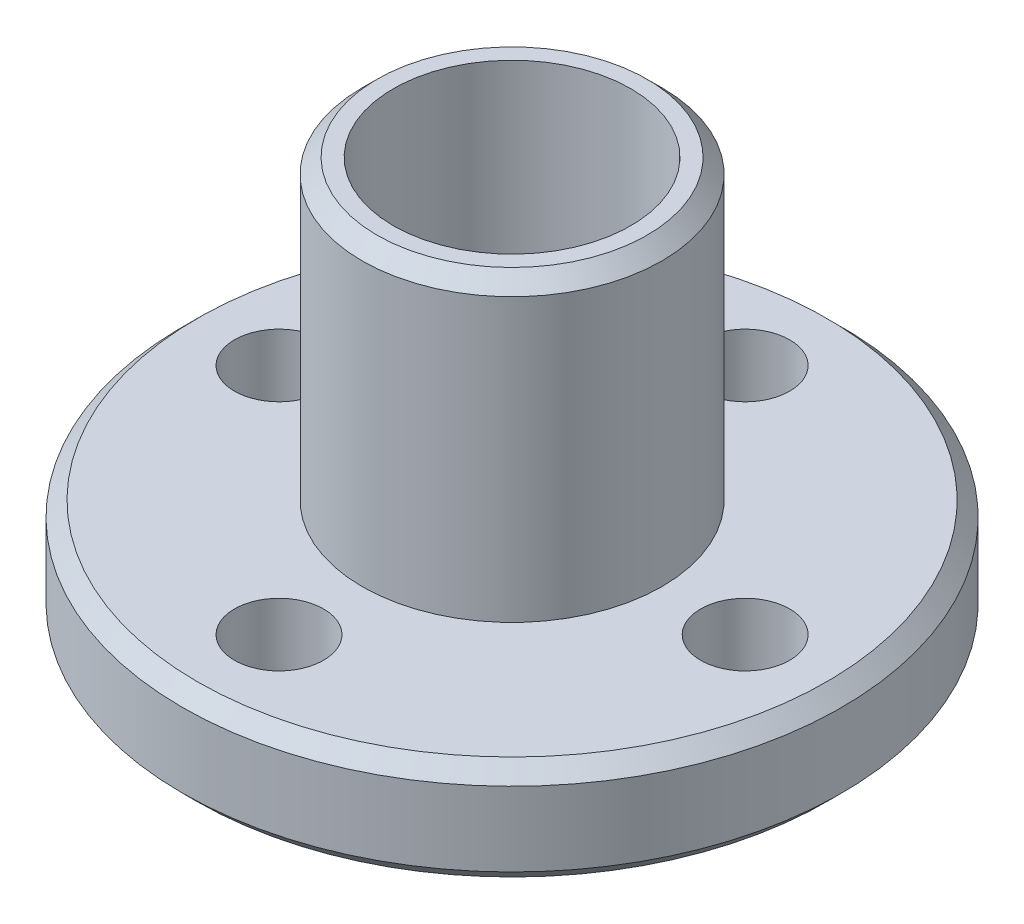
ISO-10303-21;
HEADER;
FILE_DESCRIPTION(('STEP AP214'),'2;1');
FILE_NAME('part.step','',(''),(''),'','','');
FILE_SCHEMA(('AUTOMOTIVE_DESIGN { 1 0 10303 214 1 1 1 1 }'));
ENDSEC;
DATA;
#1=APPLICATION_CONTEXT('core data for automotive mechanical design processes');
#2=APPLICATION_PROTOCOL_DEFINITION('international standard','automotive_design',2000,#1);
#3=PRODUCT_CONTEXT('',#1,'mechanical');
#4=PRODUCT('Part','Part','',(#3));
#5=PRODUCT_RELATED_PRODUCT_CATEGORY('part','',(#4));
#6=PRODUCT_DEFINITION_FORMATION('','',#4);
#7=PRODUCT_DEFINITION_CONTEXT('part definition',#1,'design');
#8=PRODUCT_DEFINITION('design','',#6,#7);
#9=PRODUCT_DEFINITION_SHAPE('','',#8);
#10=(LENGTH_UNIT() NAMED_UNIT(*) SI_UNIT(.MILLI.,.METRE.));
#11=(NAMED_UNIT(*) PLANE_ANGLE_UNIT() SI_UNIT($,.RADIAN.));
#12=(NAMED_UNIT(*) SI_UNIT($,.STERADIAN.) SOLID_ANGLE_UNIT());
#13=UNCERTAINTY_MEASURE_WITH_UNIT(LENGTH_MEASURE(1.E-05),#10,'distance_accuracy_value','');
#14=(GEOMETRIC_REPRESENTATION_CONTEXT(3) GLOBAL_UNCERTAINTY_ASSIGNED_CONTEXT((#13)) GLOBAL_UNIT_ASSIGNED_CONTEXT((#10,
#11,#12)) REPRESENTATION_CONTEXT('',''));
#15=CARTESIAN_POINT('',(0.,0.,0.));
#16=DIRECTION('',(0.,0.,1.));
#17=DIRECTION('',(1.,0.,0.));
#18=AXIS2_PLACEMENT_3D('',#15,#16,#17);
#19=CARTESIAN_POINT('',(0.,0.,0.));
#20=DIRECTION('',(0.,1.,0.));
#21=DIRECTION('',(0.,0.,1.));
#22=AXIS2_PLACEMENT_3D('',#19,#20,#21);
#23=PLANE('',#22);
#24=CARTESIAN_POINT('',(0.,0.,0.));
#25=DIRECTION('',(0.,1.,0.));
#26=DIRECTION('',(0.,0.,1.));
#27=AXIS2_PLACEMENT_3D('',#24,#25,#26);
#28=CIRCLE('',#27,5.55);
#29=CARTESIAN_POINT('',(0.,0.,5.55));
#30=VERTEX_POINT('',#29);
#31=EDGE_CURVE('E10',#30,#30,#28,.T.);
#32=ORIENTED_EDGE('',*,*,#31,.T.);
#33=EDGE_LOOP('',(#32));
#34=FACE_BOUND('',#33,.T.);
#35=CARTESIAN_POINT('',(0.,0.,0.));
#36=DIRECTION('',(0.,1.,0.));
#37=DIRECTION('',(0.,0.,1.));
#38=AXIS2_PLACEMENT_3D('',#35,#36,#37);
#39=CIRCLE('',#38,10.6);
#40=CARTESIAN_POINT('',(0.,0.,10.6));
#41=VERTEX_POINT('',#40);
#42=EDGE_CURVE('E52',#41,#41,#39,.F.);
#43=ORIENTED_EDGE('',*,*,#42,.T.);
#44=EDGE_LOOP('',(#43));
#45=FACE_BOUND('',#44,.T.);
#46=CARTESIAN_POINT('',(-7.85,0.,0.));
#47=DIRECTION('',(0.,-1.,0.));
#48=DIRECTION('',(0.,0.,-1.));
#49=AXIS2_PLACEMENT_3D('',#46,#47,#48);
#50=CIRCLE('',#49,1.5);
#51=CARTESIAN_POINT('',(-7.85,0.,-1.5));
#52=VERTEX_POINT('',#51);
#53=EDGE_CURVE('E79',#52,#52,#50,.T.);
#54=ORIENTED_EDGE('',*,*,#53,.F.);
#55=EDGE_LOOP('',(#54));
#56=FACE_BOUND('',#55,.T.);
#57=CARTESIAN_POINT('',(0.,0.,7.85));
#58=DIRECTION('',(0.,-1.,0.));
#59=DIRECTION('',(0.,0.,-1.));
#60=AXIS2_PLACEMENT_3D('',#57,#58,#59);
#61=CIRCLE('',#60,1.5);
#62=CARTESIAN_POINT('',(0.,0.,6.35));
#63=VERTEX_POINT('',#62);
#64=EDGE_CURVE('E95',#63,#63,#61,.T.);
#65=ORIENTED_EDGE('',*,*,#64,.F.);
#66=EDGE_LOOP('',(#65));
#67=FACE_BOUND('',#66,.T.);
#68=CARTESIAN_POINT('',(7.85,0.,0.));
#69=DIRECTION('',(0.,-1.,0.));
#70=DIRECTION('',(0.,0.,-1.));
#71=AXIS2_PLACEMENT_3D('',#68,#69,#70);
#72=CIRCLE('',#71,1.5);
#73=CARTESIAN_POINT('',(7.85,0.,-1.50000000000005));
#74=VERTEX_POINT('',#73);
#75=EDGE_CURVE('E89',#74,#74,#72,.T.);
#76=ORIENTED_EDGE('',*,*,#75,.F.);
#77=EDGE_LOOP('',(#76));
#78=FACE_BOUND('',#77,.T.);
#79=CARTESIAN_POINT('',(0.,0.,-7.85));
#80=DIRECTION('',(0.,-1.,0.));
#81=DIRECTION('',(0.,0.,-1.));
#82=AXIS2_PLACEMENT_3D('',#79,#80,#81);
#83=CIRCLE('',#82,1.5);
#84=CARTESIAN_POINT('',(0.,0.,-9.35));
#85=VERTEX_POINT('',#84);
#86=EDGE_CURVE('E83',#85,#85,#83,.T.);
#87=ORIENTED_EDGE('',*,*,#86,.F.);
#88=EDGE_LOOP('',(#87));
#89=FACE_BOUND('',#88,.T.);
#90=ADVANCED_FACE('F32',(#34,#45,#56,#67,#78,#89),#23,.F.);
#91=CARTESIAN_POINT('',(0.,3.5,0.));
#92=DIRECTION('',(0.,1.,0.));
#93=DIRECTION('',(0.,0.,1.));
#94=AXIS2_PLACEMENT_3D('',#91,#92,#93);
#95=PLANE('',#94);
#96=CARTESIAN_POINT('',(0.,3.5,0.));
#97=DIRECTION('',(0.,1.,0.));
#98=DIRECTION('',(0.,0.,1.));
#99=AXIS2_PLACEMENT_3D('',#96,#97,#98);
#100=CIRCLE('',#99,10.6);
#101=CARTESIAN_POINT('',(0.,3.5,10.6));
#102=VERTEX_POINT('',#101);
#103=EDGE_CURVE('E61',#102,#102,#100,.T.);
#104=ORIENTED_EDGE('',*,*,#103,.T.);
#105=EDGE_LOOP('',(#104));
#106=FACE_BOUND('',#105,.T.);
#107=CARTESIAN_POINT('',(-7.85,3.5,0.));
#108=DIRECTION('',(0.,1.,0.));
#109=DIRECTION('',(0.,0.,1.));
#110=AXIS2_PLACEMENT_3D('',#107,#108,#109);
#111=CIRCLE('',#110,1.5);
#112=CARTESIAN_POINT('',(-7.85,3.5,-1.5));
#113=VERTEX_POINT('',#112);
#114=EDGE_CURVE('E98',#113,#113,#111,.F.);
#115=ORIENTED_EDGE('',*,*,#114,.T.);
#116=EDGE_LOOP('',(#115));
#117=FACE_BOUND('',#116,.T.);
#118=CARTESIAN_POINT('',(0.,3.5,7.85));
#119=DIRECTION('',(0.,1.,0.));
#120=DIRECTION('',(0.,0.,1.));
#121=AXIS2_PLACEMENT_3D('',#118,#119,#120);
#122=CIRCLE('',#121,1.5);
#123=CARTESIAN_POINT('',(0.,3.5,6.35));
#124=VERTEX_POINT('',#123);
#125=EDGE_CURVE('E92',#124,#124,#122,.F.);
#126=ORIENTED_EDGE('',*,*,#125,.T.);
#127=EDGE_LOOP('',(#126));
#128=FACE_BOUND('',#127,.T.);
#129=CARTESIAN_POINT('',(7.85,3.5,0.));
#130=DIRECTION('',(0.,1.,0.));
#131=DIRECTION('',(0.,0.,1.));
#132=AXIS2_PLACEMENT_3D('',#129,#130,#131);
#133=CIRCLE('',#132,1.5);
#134=CARTESIAN_POINT('',(7.85,3.5,-1.50000000000005));
#135=VERTEX_POINT('',#134);
#136=EDGE_CURVE('E86',#135,#135,#133,.F.);
#137=ORIENTED_EDGE('',*,*,#136,.T.);
#138=EDGE_LOOP('',(#137));
#139=FACE_BOUND('',#138,.T.);
#140=CARTESIAN_POINT('',(0.,3.5,-7.85));
#141=DIRECTION('',(0.,1.,0.));
#142=DIRECTION('',(0.,0.,1.));
#143=AXIS2_PLACEMENT_3D('',#140,#141,#142);
#144=CIRCLE('',#143,1.5);
#145=CARTESIAN_POINT('',(0.,3.5,-9.35));
#146=VERTEX_POINT('',#145);
#147=EDGE_CURVE('E80',#146,#146,#144,.F.);
#148=ORIENTED_EDGE('',*,*,#147,.T.);
#149=EDGE_LOOP('',(#148));
#150=FACE_BOUND('',#149,.T.);
#151=CARTESIAN_POINT('',(0.,3.5,0.));
#152=DIRECTION('',(0.,1.,0.));
#153=DIRECTION('',(0.,0.,1.));
#154=AXIS2_PLACEMENT_3D('',#151,#152,#153);
#155=CIRCLE('',#154,5.05);
#156=CARTESIAN_POINT('',(0.,3.5,5.05));
#157=VERTEX_POINT('',#156);
#158=EDGE_CURVE('E70',#157,#157,#155,.T.);
#159=ORIENTED_EDGE('',*,*,#158,.F.);
#160=EDGE_LOOP('',(#159));
#161=FACE_BOUND('',#160,.T.);
#162=ADVANCED_FACE('F108',(#106,#117,#128,#139,#150,#161),#95,.T.);
#163=CARTESIAN_POINT('',(0.,3.5,0.));
#164=DIRECTION('',(0.,-1.,0.));
#165=DIRECTION('',(0.,0.,-1.));
#166=AXIS2_PLACEMENT_3D('',#163,#164,#165);
#167=CYLINDRICAL_SURFACE('',#166,11.1);
#168=CARTESIAN_POINT('',(0.,3.,0.));
#169=DIRECTION('',(0.,1.,0.));
#170=DIRECTION('',(0.,0.,1.));
#171=AXIS2_PLACEMENT_3D('',#168,#169,#170);
#172=CIRCLE('',#171,11.1);
#173=CARTESIAN_POINT('',(0.,3.,11.1));
#174=VERTEX_POINT('',#173);
#175=EDGE_CURVE('E55',#174,#174,#172,.F.);
#176=ORIENTED_EDGE('',*,*,#175,.T.);
#177=EDGE_LOOP('',(#176));
#178=FACE_BOUND('',#177,.T.);
#179=CARTESIAN_POINT('',(0.,0.500000000000004,0.));
#180=DIRECTION('',(0.,1.,0.));
#181=DIRECTION('',(0.,0.,1.));
#182=AXIS2_PLACEMENT_3D('',#179,#180,#181);
#183=CIRCLE('',#182,11.1);
#184=CARTESIAN_POINT('',(0.,0.500000000000004,11.1));
#185=VERTEX_POINT('',#184);
#186=EDGE_CURVE('E58',#185,#185,#183,.T.);
#187=ORIENTED_EDGE('',*,*,#186,.T.);
#188=EDGE_LOOP('',(#187));
#189=FACE_BOUND('',#188,.T.);
#190=ADVANCED_FACE('F148',(#178,#189),#167,.T.);
#191=CARTESIAN_POINT('',(0.,3.5,0.));
#192=DIRECTION('',(0.,-1.,0.));
#193=DIRECTION('',(0.,0.,-1.));
#194=AXIS2_PLACEMENT_3D('',#191,#192,#193);
#195=CYLINDRICAL_SURFACE('',#194,4.);
#196=CARTESIAN_POINT('',(0.,13.5,0.));
#197=DIRECTION('',(0.,1.,0.));
#198=DIRECTION('',(0.,0.,1.));
#199=AXIS2_PLACEMENT_3D('',#196,#197,#198);
#200=CIRCLE('',#199,4.);
#201=CARTESIAN_POINT('',(0.,13.5,4.));
#202=VERTEX_POINT('',#201);
#203=EDGE_CURVE('E73',#202,#202,#200,.T.);
#204=ORIENTED_EDGE('',*,*,#203,.T.);
#205=EDGE_LOOP('',(#204));
#206=FACE_BOUND('',#205,.T.);
#207=CARTESIAN_POINT('',(0.,-1.5,0.));
#208=DIRECTION('',(0.,-1.,0.));
#209=DIRECTION('',(0.,0.,-1.));
#210=AXIS2_PLACEMENT_3D('',#207,#208,#209);
#211=CIRCLE('',#210,4.);
#212=CARTESIAN_POINT('',(0.,-1.5,-4.));
#213=VERTEX_POINT('',#212);
#214=EDGE_CURVE('E76',#213,#213,#211,.T.);
#215=ORIENTED_EDGE('',*,*,#214,.T.);
#216=EDGE_LOOP('',(#215));
#217=FACE_BOUND('',#216,.T.);
#218=ADVANCED_FACE('F141',(#206,#217),#195,.F.);
#219=CARTESIAN_POINT('',(0.,13.5,0.));
#220=DIRECTION('',(0.,1.,0.));
#221=DIRECTION('',(0.,0.,1.));
#222=AXIS2_PLACEMENT_3D('',#219,#220,#221);
#223=PLANE('',#222);
#224=CARTESIAN_POINT('',(0.,13.5,0.));
#225=DIRECTION('',(0.,1.,0.));
#226=DIRECTION('',(0.,0.,1.));
#227=AXIS2_PLACEMENT_3D('',#224,#225,#226);
#228=CIRCLE('',#227,4.55);
#229=CARTESIAN_POINT('',(0.,13.5,4.55));
#230=VERTEX_POINT('',#229);
#231=EDGE_CURVE('E67',#230,#230,#228,.T.);
#232=ORIENTED_EDGE('',*,*,#231,.T.);
#233=EDGE_LOOP('',(#232));
#234=FACE_BOUND('',#233,.T.);
#235=ORIENTED_EDGE('',*,*,#203,.F.);
#236=EDGE_LOOP('',(#235));
#237=FACE_BOUND('',#236,.T.);
#238=ADVANCED_FACE('F138',(#234,#237),#223,.T.);
#239=CARTESIAN_POINT('',(0.,13.5,0.));
#240=DIRECTION('',(0.,-1.,0.));
#241=DIRECTION('',(0.,0.,-1.));
#242=AXIS2_PLACEMENT_3D('',#239,#240,#241);
#243=CYLINDRICAL_SURFACE('',#242,5.05);
#244=CARTESIAN_POINT('',(0.,13.,0.));
#245=DIRECTION('',(0.,1.,0.));
#246=DIRECTION('',(0.,0.,1.));
#247=AXIS2_PLACEMENT_3D('',#244,#245,#246);
#248=CIRCLE('',#247,5.05);
#249=CARTESIAN_POINT('',(0.,13.,5.05));
#250=VERTEX_POINT('',#249);
#251=EDGE_CURVE('E64',#250,#250,#248,.F.);
#252=ORIENTED_EDGE('',*,*,#251,.T.);
#253=EDGE_LOOP('',(#252));
#254=FACE_BOUND('',#253,.T.);
#255=ORIENTED_EDGE('',*,*,#158,.T.);
#256=EDGE_LOOP('',(#255));
#257=FACE_BOUND('',#256,.T.);
#258=ADVANCED_FACE('F135',(#254,#257),#243,.T.);
#259=CARTESIAN_POINT('',(0.,-1.5,0.));
#260=DIRECTION('',(0.,-1.,0.));
#261=DIRECTION('',(0.,0.,-1.));
#262=AXIS2_PLACEMENT_3D('',#259,#260,#261);
#263=PLANE('',#262);
#264=CARTESIAN_POINT('',(0.,-1.5,0.));
#265=DIRECTION('',(0.,-1.,0.));
#266=DIRECTION('',(0.,0.,-1.));
#267=AXIS2_PLACEMENT_3D('',#264,#265,#266);
#268=CIRCLE('',#267,4.55);
#269=CARTESIAN_POINT('',(0.,-1.5,-4.55));
#270=VERTEX_POINT('',#269);
#271=EDGE_CURVE('E47',#270,#270,#268,.T.);
#272=ORIENTED_EDGE('',*,*,#271,.T.);
#273=EDGE_LOOP('',(#272));
#274=FACE_BOUND('',#273,.T.);
#275=ORIENTED_EDGE('',*,*,#214,.F.);
#276=EDGE_LOOP('',(#275));
#277=FACE_BOUND('',#276,.T.);
#278=ADVANCED_FACE('F129',(#274,#277),#263,.T.);
#279=CARTESIAN_POINT('',(0.,-1.5,0.));
#280=DIRECTION('',(0.,1.,0.));
#281=DIRECTION('',(0.,0.,1.));
#282=AXIS2_PLACEMENT_3D('',#279,#280,#281);
#283=CYLINDRICAL_SURFACE('',#282,5.05);
#284=CARTESIAN_POINT('',(0.,-0.500000000000002,0.));
#285=DIRECTION('',(0.,1.,0.));
#286=DIRECTION('',(0.,0.,1.));
#287=AXIS2_PLACEMENT_3D('',#284,#285,#286);
#288=CIRCLE('',#287,5.05);
#289=CARTESIAN_POINT('',(0.,-0.500000000000002,5.05));
#290=VERTEX_POINT('',#289);
#291=EDGE_CURVE('E39',#290,#290,#288,.F.);
#292=ORIENTED_EDGE('',*,*,#291,.T.);
#293=EDGE_LOOP('',(#292));
#294=FACE_BOUND('',#293,.T.);
#295=CARTESIAN_POINT('',(0.,-0.999999999999999,0.));
#296=DIRECTION('',(0.,-1.,0.));
#297=DIRECTION('',(0.,0.,-1.));
#298=AXIS2_PLACEMENT_3D('',#295,#296,#297);
#299=CIRCLE('',#298,5.05);
#300=CARTESIAN_POINT('',(0.,-0.999999999999999,-5.05));
#301=VERTEX_POINT('',#300);
#302=EDGE_CURVE('E43',#301,#301,#299,.F.);
#303=ORIENTED_EDGE('',*,*,#302,.T.);
#304=EDGE_LOOP('',(#303));
#305=FACE_BOUND('',#304,.T.);
#306=ADVANCED_FACE('F119',(#294,#305),#283,.T.);
#307=CARTESIAN_POINT('',(0.,13.501,-7.85));
#308=DIRECTION('',(0.,-1.,0.));
#309=DIRECTION('',(0.,0.,-1.));
#310=AXIS2_PLACEMENT_3D('',#307,#308,#309);
#311=CYLINDRICAL_SURFACE('',#310,1.5);
#312=CARTESIAN_POINT('',(0.,3.5,-9.35));
#313=CARTESIAN_POINT('',(0.,3.46354166666666,-9.35));
#314=CARTESIAN_POINT('',(0.,3.42708333333333,-9.35));
#315=CARTESIAN_POINT('',(0.,3.35416666666666,-9.35));
#316=CARTESIAN_POINT('',(0.,3.31770833333333,-9.35));
#317=CARTESIAN_POINT('',(0.,3.24479166666666,-9.35));
#318=CARTESIAN_POINT('',(0.,3.20833333333333,-9.35));
#319=CARTESIAN_POINT('',(0.,3.13541666666666,-9.35));
#320=CARTESIAN_POINT('',(0.,3.09895833333333,-9.35));
#321=CARTESIAN_POINT('',(0.,3.02604166666666,-9.35));
#322=CARTESIAN_POINT('',(0.,2.98958333333333,-9.35));
#323=CARTESIAN_POINT('',(0.,2.91666666666667,-9.35));
#324=CARTESIAN_POINT('',(0.,2.88020833333333,-9.35));
#325=CARTESIAN_POINT('',(0.,2.80729166666667,-9.35));
#326=CARTESIAN_POINT('',(0.,2.77083333333333,-9.35));
#327=CARTESIAN_POINT('',(0.,2.69791666666667,-9.35));
#328=CARTESIAN_POINT('',(0.,2.66145833333333,-9.35));
#329=CARTESIAN_POINT('',(0.,2.58854166666667,-9.35));
#330=CARTESIAN_POINT('',(0.,2.55208333333333,-9.35));
#331=CARTESIAN_POINT('',(0.,2.47916666666667,-9.35));
#332=CARTESIAN_POINT('',(0.,2.44270833333333,-9.35));
#333=CARTESIAN_POINT('',(0.,2.36979166666667,-9.35));
#334=CARTESIAN_POINT('',(0.,2.33333333333333,-9.35));
#335=CARTESIAN_POINT('',(0.,2.26041666666667,-9.35));
#336=CARTESIAN_POINT('',(0.,2.22395833333333,-9.35));
#337=CARTESIAN_POINT('',(0.,2.15104166666667,-9.35));
#338=CARTESIAN_POINT('',(0.,2.11458333333333,-9.35));
#339=CARTESIAN_POINT('',(0.,2.04166666666667,-9.35));
#340=CARTESIAN_POINT('',(0.,2.00520833333333,-9.35));
#341=CARTESIAN_POINT('',(0.,1.93229166666667,-9.35));
#342=CARTESIAN_POINT('',(0.,1.89583333333333,-9.35));
#343=CARTESIAN_POINT('',(0.,1.82291666666667,-9.35));
#344=CARTESIAN_POINT('',(0.,1.78645833333333,-9.35));
#345=CARTESIAN_POINT('',(0.,1.71354166666667,-9.35));
#346=CARTESIAN_POINT('',(0.,1.67708333333333,-9.35));
#347=CARTESIAN_POINT('',(0.,1.60416666666667,-9.35));
#348=CARTESIAN_POINT('',(0.,1.56770833333333,-9.35));
#349=CARTESIAN_POINT('',(0.,1.49479166666667,-9.35));
#350=CARTESIAN_POINT('',(0.,1.45833333333333,-9.35));
#351=CARTESIAN_POINT('',(0.,1.38541666666667,-9.35));
#352=CARTESIAN_POINT('',(0.,1.34895833333333,-9.35));
#353=CARTESIAN_POINT('',(0.,1.27604166666667,-9.35));
#354=CARTESIAN_POINT('',(0.,1.23958333333333,-9.35));
#355=CARTESIAN_POINT('',(0.,1.16666666666667,-9.35));
#356=CARTESIAN_POINT('',(0.,1.13020833333333,-9.35));
#357=CARTESIAN_POINT('',(0.,1.05729166666667,-9.35));
#358=CARTESIAN_POINT('',(0.,1.02083333333333,-9.35));
#359=CARTESIAN_POINT('',(0.,0.947916666666668,-9.35));
#360=CARTESIAN_POINT('',(0.,0.911458333333334,-9.35));
#361=CARTESIAN_POINT('',(0.,0.838541666666667,-9.35));
#362=CARTESIAN_POINT('',(0.,0.802083333333334,-9.35));
#363=CARTESIAN_POINT('',(0.,0.729166666666667,-9.35));
#364=CARTESIAN_POINT('',(0.,0.692708333333334,-9.35));
#365=CARTESIAN_POINT('',(0.,0.619791666666667,-9.35));
#366=CARTESIAN_POINT('',(0.,0.583333333333334,-9.35));
#367=CARTESIAN_POINT('',(0.,0.510416666666668,-9.35));
#368=CARTESIAN_POINT('',(0.,0.473958333333335,-9.35));
#369=CARTESIAN_POINT('',(0.,0.401041666666668,-9.35));
#370=CARTESIAN_POINT('',(0.,0.364583333333334,-9.35));
#371=CARTESIAN_POINT('',(0.,0.291666666666668,-9.35));
#372=CARTESIAN_POINT('',(0.,0.255208333333335,-9.35));
#373=CARTESIAN_POINT('',(0.,0.182291666666669,-9.35));
#374=CARTESIAN_POINT('',(0.,0.145833333333335,-9.35));
#375=CARTESIAN_POINT('',(0.,0.0729166666666685,-9.35));
#376=CARTESIAN_POINT('',(0.,0.0364583333333351,-9.35));
#377=CARTESIAN_POINT('',(0.,0.,-9.35));
#378=B_SPLINE_CURVE_WITH_KNOTS('',3,(#312,#313,#314,#315,#316,#317,#318,#319,#320,#321,#322,
#323,#324,#325,#326,#327,#328,#329,#330,#331,#332,#333,#334,#335,#336,#337,#338,#339,#340,#341,
#342,#343,#344,#345,#346,#347,#348,#349,#350,#351,#352,#353,#354,#355,#356,#357,#358,#359,#360,
#361,#362,#363,#364,#365,#366,#367,#368,#369,#370,#371,#372,#373,#374,#375,#376,#377),
.UNSPECIFIED.,.F.,.F.,(4,2,2,2,2,2,2,2,2,2,2,2,2,2,2,2,2,2,2,2,2,2,2,2,2,2,2,2,2,2,2,2,4),(0.,
0.109375,0.21875,0.328125,0.4375,0.546874999999999,0.656249999999999,0.765624999999999,
0.874999999999999,0.984374999999999,1.09375,1.203125,1.3125,1.421875,1.53125,1.640625,1.75,
1.859375,1.96875,2.078125,2.1875,2.296875,2.40625,2.515625,2.625,2.734375,2.84375,2.953125,
3.0625,3.171875,3.28125,3.390625,3.5),.UNSPECIFIED.);
#379=EDGE_CURVE('BSEAM116',#146,#85,#378,.T.);
#380=ORIENTED_EDGE('',*,*,#147,.F.);
#381=ORIENTED_EDGE('',*,*,#86,.T.);
#382=ORIENTED_EDGE('',*,*,#379,.T.);
#383=ORIENTED_EDGE('',*,*,#379,.F.);
#384=EDGE_LOOP('',(#380,#382,#381,#383));
#385=FACE_BOUND('',#384,.T.);
#386=ADVANCED_FACE('F116',(#385),#311,.F.);
#387=CARTESIAN_POINT('',(7.85,13.501,0.));
#388=DIRECTION('',(0.,-1.,0.));
#389=DIRECTION('',(0.,0.,-1.));
#390=AXIS2_PLACEMENT_3D('',#387,#388,#389);
#391=CYLINDRICAL_SURFACE('',#390,1.5);
#392=CARTESIAN_POINT('',(7.85,3.5,-1.50000000000005));
#393=CARTESIAN_POINT('',(7.85,3.46354166666666,-1.50000000000005));
#394=CARTESIAN_POINT('',(7.85,3.42708333333333,-1.50000000000005));
#395=CARTESIAN_POINT('',(7.85,3.35416666666666,-1.50000000000005));
#396=CARTESIAN_POINT('',(7.85,3.31770833333333,-1.50000000000005));
#397=CARTESIAN_POINT('',(7.85,3.24479166666666,-1.50000000000005));
#398=CARTESIAN_POINT('',(7.85,3.20833333333333,-1.50000000000005));
#399=CARTESIAN_POINT('',(7.85,3.13541666666666,-1.50000000000005));
#400=CARTESIAN_POINT('',(7.85,3.09895833333333,-1.50000000000005));
#401=CARTESIAN_POINT('',(7.85,3.02604166666666,-1.50000000000005));
#402=CARTESIAN_POINT('',(7.85,2.98958333333333,-1.50000000000005));
#403=CARTESIAN_POINT('',(7.85,2.91666666666667,-1.50000000000005));
#404=CARTESIAN_POINT('',(7.85,2.88020833333333,-1.50000000000005));
#405=CARTESIAN_POINT('',(7.85,2.80729166666667,-1.50000000000005));
#406=CARTESIAN_POINT('',(7.85,2.77083333333333,-1.50000000000005));
#407=CARTESIAN_POINT('',(7.85,2.69791666666667,-1.50000000000005));
#408=CARTESIAN_POINT('',(7.85,2.66145833333333,-1.50000000000005));
#409=CARTESIAN_POINT('',(7.85,2.58854166666667,-1.50000000000005));
#410=CARTESIAN_POINT('',(7.85,2.55208333333333,-1.50000000000005));
#411=CARTESIAN_POINT('',(7.85,2.47916666666667,-1.50000000000005));
#412=CARTESIAN_POINT('',(7.85,2.44270833333333,-1.50000000000005));
#413=CARTESIAN_POINT('',(7.85,2.36979166666667,-1.50000000000005));
#414=CARTESIAN_POINT('',(7.85,2.33333333333333,-1.50000000000005));
#415=CARTESIAN_POINT('',(7.85,2.26041666666667,-1.50000000000005));
#416=CARTESIAN_POINT('',(7.85,2.22395833333333,-1.50000000000005));
#417=CARTESIAN_POINT('',(7.85,2.15104166666667,-1.50000000000005));
#418=CARTESIAN_POINT('',(7.85,2.11458333333333,-1.50000000000005));
#419=CARTESIAN_POINT('',(7.85,2.04166666666667,-1.50000000000005));
#420=CARTESIAN_POINT('',(7.85,2.00520833333333,-1.50000000000005));
#421=CARTESIAN_POINT('',(7.85,1.93229166666667,-1.50000000000005));
#422=CARTESIAN_POINT('',(7.85,1.89583333333333,-1.50000000000005));
#423=CARTESIAN_POINT('',(7.85,1.82291666666667,-1.50000000000005));
#424=CARTESIAN_POINT('',(7.85,1.78645833333333,-1.50000000000005));
#425=CARTESIAN_POINT('',(7.85,1.71354166666667,-1.50000000000005));
#426=CARTESIAN_POINT('',(7.85,1.67708333333333,-1.50000000000005));
#427=CARTESIAN_POINT('',(7.85,1.60416666666667,-1.50000000000005));
#428=CARTESIAN_POINT('',(7.85,1.56770833333333,-1.50000000000005));
#429=CARTESIAN_POINT('',(7.85,1.49479166666667,-1.50000000000005));
#430=CARTESIAN_POINT('',(7.85,1.45833333333333,-1.50000000000005));
#431=CARTESIAN_POINT('',(7.85,1.38541666666667,-1.50000000000005));
#432=CARTESIAN_POINT('',(7.85,1.34895833333333,-1.50000000000005));
#433=CARTESIAN_POINT('',(7.85,1.27604166666667,-1.50000000000005));
#434=CARTESIAN_POINT('',(7.85,1.23958333333333,-1.50000000000005));
#435=CARTESIAN_POINT('',(7.85,1.16666666666667,-1.50000000000005));
#436=CARTESIAN_POINT('',(7.85,1.13020833333333,-1.50000000000005));
#437=CARTESIAN_POINT('',(7.85,1.05729166666667,-1.50000000000005));
#438=CARTESIAN_POINT('',(7.85,1.02083333333333,-1.50000000000005));
#439=CARTESIAN_POINT('',(7.85,0.947916666666668,-1.50000000000005));
#440=CARTESIAN_POINT('',(7.85,0.911458333333334,-1.50000000000005));
#441=CARTESIAN_POINT('',(7.85,0.838541666666667,-1.50000000000005));
#442=CARTESIAN_POINT('',(7.85,0.802083333333334,-1.50000000000005));
#443=CARTESIAN_POINT('',(7.85,0.729166666666667,-1.50000000000005));
#444=CARTESIAN_POINT('',(7.85,0.692708333333334,-1.50000000000005));
#445=CARTESIAN_POINT('',(7.85,0.619791666666667,-1.50000000000005));
#446=CARTESIAN_POINT('',(7.85,0.583333333333334,-1.50000000000005));
#447=CARTESIAN_POINT('',(7.85,0.510416666666668,-1.50000000000005));
#448=CARTESIAN_POINT('',(7.85,0.473958333333335,-1.50000000000005));
#449=CARTESIAN_POINT('',(7.85,0.401041666666668,-1.50000000000005));
#450=CARTESIAN_POINT('',(7.85,0.364583333333334,-1.50000000000005));
#451=CARTESIAN_POINT('',(7.85,0.291666666666668,-1.50000000000005));
#452=CARTESIAN_POINT('',(7.85,0.255208333333335,-1.50000000000005));
#453=CARTESIAN_POINT('',(7.85,0.182291666666669,-1.50000000000005));
#454=CARTESIAN_POINT('',(7.85,0.145833333333335,-1.50000000000005));
#455=CARTESIAN_POINT('',(7.85,0.0729166666666685,-1.50000000000005));
#456=CARTESIAN_POINT('',(7.85,0.0364583333333351,-1.50000000000005));
#457=CARTESIAN_POINT('',(7.85,0.,-1.50000000000005));
#458=B_SPLINE_CURVE_WITH_KNOTS('',3,(#392,#393,#394,#395,#396,#397,#398,#399,#400,#401,#402,
#403,#404,#405,#406,#407,#408,#409,#410,#411,#412,#413,#414,#415,#416,#417,#418,#419,#420,#421,
#422,#423,#424,#425,#426,#427,#428,#429,#430,#431,#432,#433,#434,#435,#436,#437,#438,#439,#440,
#441,#442,#443,#444,#445,#446,#447,#448,#449,#450,#451,#452,#453,#454,#455,#456,#457),
.UNSPECIFIED.,.F.,.F.,(4,2,2,2,2,2,2,2,2,2,2,2,2,2,2,2,2,2,2,2,2,2,2,2,2,2,2,2,2,2,2,2,4),(0.,
0.109375,0.21875,0.328125,0.4375,0.546874999999999,0.656249999999999,0.765624999999999,
0.874999999999999,0.984374999999999,1.09375,1.203125,1.3125,1.421875,1.53125,1.640625,1.75,
1.859375,1.96875,2.078125,2.1875,2.296875,2.40625,2.515625,2.625,2.734375,2.84375,2.953125,
3.0625,3.171875,3.28125,3.390625,3.5),.UNSPECIFIED.);
#459=EDGE_CURVE('BSEAM118',#135,#74,#458,.T.);
#460=ORIENTED_EDGE('',*,*,#136,.F.);
#461=ORIENTED_EDGE('',*,*,#75,.T.);
#462=ORIENTED_EDGE('',*,*,#459,.T.);
#463=ORIENTED_EDGE('',*,*,#459,.F.);
#464=EDGE_LOOP('',(#460,#462,#461,#463));
#465=FACE_BOUND('',#464,.T.);
#466=ADVANCED_FACE('F118',(#465),#391,.F.);
#467=CARTESIAN_POINT('',(0.,13.501,7.85));
#468=DIRECTION('',(0.,-1.,0.));
#469=DIRECTION('',(0.,0.,-1.));
#470=AXIS2_PLACEMENT_3D('',#467,#468,#469);
#471=CYLINDRICAL_SURFACE('',#470,1.5);
#472=CARTESIAN_POINT('',(0.,3.5,6.35));
#473=CARTESIAN_POINT('',(0.,3.46354166666666,6.35));
#474=CARTESIAN_POINT('',(0.,3.42708333333333,6.35));
#475=CARTESIAN_POINT('',(0.,3.35416666666666,6.35));
#476=CARTESIAN_POINT('',(0.,3.31770833333333,6.35));
#477=CARTESIAN_POINT('',(0.,3.24479166666666,6.35));
#478=CARTESIAN_POINT('',(0.,3.20833333333333,6.35));
#479=CARTESIAN_POINT('',(0.,3.13541666666666,6.35));
#480=CARTESIAN_POINT('',(0.,3.09895833333333,6.35));
#481=CARTESIAN_POINT('',(0.,3.02604166666666,6.35));
#482=CARTESIAN_POINT('',(0.,2.98958333333333,6.35));
#483=CARTESIAN_POINT('',(0.,2.91666666666667,6.35));
#484=CARTESIAN_POINT('',(0.,2.88020833333333,6.35));
#485=CARTESIAN_POINT('',(0.,2.80729166666667,6.35));
#486=CARTESIAN_POINT('',(0.,2.77083333333333,6.35));
#487=CARTESIAN_POINT('',(0.,2.69791666666667,6.35));
#488=CARTESIAN_POINT('',(0.,2.66145833333333,6.35));
#489=CARTESIAN_POINT('',(0.,2.58854166666667,6.35));
#490=CARTESIAN_POINT('',(0.,2.55208333333333,6.35));
#491=CARTESIAN_POINT('',(0.,2.47916666666667,6.35));
#492=CARTESIAN_POINT('',(0.,2.44270833333333,6.35));
#493=CARTESIAN_POINT('',(0.,2.36979166666667,6.35));
#494=CARTESIAN_POINT('',(0.,2.33333333333333,6.35));
#495=CARTESIAN_POINT('',(0.,2.26041666666667,6.35));
#496=CARTESIAN_POINT('',(0.,2.22395833333333,6.35));
#497=CARTESIAN_POINT('',(0.,2.15104166666667,6.35));
#498=CARTESIAN_POINT('',(0.,2.11458333333333,6.35));
#499=CARTESIAN_POINT('',(0.,2.04166666666667,6.35));
#500=CARTESIAN_POINT('',(0.,2.00520833333333,6.35));
#501=CARTESIAN_POINT('',(0.,1.93229166666667,6.35));
#502=CARTESIAN_POINT('',(0.,1.89583333333333,6.35));
#503=CARTESIAN_POINT('',(0.,1.82291666666667,6.35));
#504=CARTESIAN_POINT('',(0.,1.78645833333333,6.35));
#505=CARTESIAN_POINT('',(0.,1.71354166666667,6.35));
#506=CARTESIAN_POINT('',(0.,1.67708333333333,6.35));
#507=CARTESIAN_POINT('',(0.,1.60416666666667,6.35));
#508=CARTESIAN_POINT('',(0.,1.56770833333333,6.35));
#509=CARTESIAN_POINT('',(0.,1.49479166666667,6.35));
#510=CARTESIAN_POINT('',(0.,1.45833333333333,6.35));
#511=CARTESIAN_POINT('',(0.,1.38541666666667,6.35));
#512=CARTESIAN_POINT('',(0.,1.34895833333333,6.35));
#513=CARTESIAN_POINT('',(0.,1.27604166666667,6.35));
#514=CARTESIAN_POINT('',(0.,1.23958333333333,6.35));
#515=CARTESIAN_POINT('',(0.,1.16666666666667,6.35));
#516=CARTESIAN_POINT('',(0.,1.13020833333333,6.35));
#517=CARTESIAN_POINT('',(0.,1.05729166666667,6.35));
#518=CARTESIAN_POINT('',(0.,1.02083333333333,6.35));
#519=CARTESIAN_POINT('',(0.,0.947916666666668,6.35));
#520=CARTESIAN_POINT('',(0.,0.911458333333334,6.35));
#521=CARTESIAN_POINT('',(0.,0.838541666666667,6.35));
#522=CARTESIAN_POINT('',(0.,0.802083333333334,6.35));
#523=CARTESIAN_POINT('',(0.,0.729166666666667,6.35));
#524=CARTESIAN_POINT('',(0.,0.692708333333334,6.35));
#525=CARTESIAN_POINT('',(0.,0.619791666666667,6.35));
#526=CARTESIAN_POINT('',(0.,0.583333333333334,6.35));
#527=CARTESIAN_POINT('',(0.,0.510416666666668,6.35));
#528=CARTESIAN_POINT('',(0.,0.473958333333335,6.35));
#529=CARTESIAN_POINT('',(0.,0.401041666666668,6.35));
#530=CARTESIAN_POINT('',(0.,0.364583333333334,6.35));
#531=CARTESIAN_POINT('',(0.,0.291666666666668,6.35));
#532=CARTESIAN_POINT('',(0.,0.255208333333335,6.35));
#533=CARTESIAN_POINT('',(0.,0.182291666666669,6.35));
#534=CARTESIAN_POINT('',(0.,0.145833333333335,6.35));
#535=CARTESIAN_POINT('',(0.,0.0729166666666685,6.35));
#536=CARTESIAN_POINT('',(0.,0.0364583333333351,6.35));
#537=CARTESIAN_POINT('',(0.,0.,6.35));
#538=B_SPLINE_CURVE_WITH_KNOTS('',3,(#472,#473,#474,#475,#476,#477,#478,#479,#480,#481,#482,
#483,#484,#485,#486,#487,#488,#489,#490,#491,#492,#493,#494,#495,#496,#497,#498,#499,#500,#501,
#502,#503,#504,#505,#506,#507,#508,#509,#510,#511,#512,#513,#514,#515,#516,#517,#518,#519,#520,
#521,#522,#523,#524,#525,#526,#527,#528,#529,#530,#531,#532,#533,#534,#535,#536,#537),
.UNSPECIFIED.,.F.,.F.,(4,2,2,2,2,2,2,2,2,2,2,2,2,2,2,2,2,2,2,2,2,2,2,2,2,2,2,2,2,2,2,2,4),(0.,
0.109375,0.21875,0.328125,0.4375,0.546874999999999,0.656249999999999,0.765624999999999,
0.874999999999999,0.984374999999999,1.09375,1.203125,1.3125,1.421875,1.53125,1.640625,1.75,
1.859375,1.96875,2.078125,2.1875,2.296875,2.40625,2.515625,2.625,2.734375,2.84375,2.953125,
3.0625,3.171875,3.28125,3.390625,3.5),.UNSPECIFIED.);
#539=EDGE_CURVE('BSEAM126',#124,#63,#538,.T.);
#540=ORIENTED_EDGE('',*,*,#125,.F.);
#541=ORIENTED_EDGE('',*,*,#64,.T.);
#542=ORIENTED_EDGE('',*,*,#539,.T.);
#543=ORIENTED_EDGE('',*,*,#539,.F.);
#544=EDGE_LOOP('',(#540,#542,#541,#543));
#545=FACE_BOUND('',#544,.T.);
#546=ADVANCED_FACE('F126',(#545),#471,.F.);
#547=CARTESIAN_POINT('',(-7.85,13.501,0.));
#548=DIRECTION('',(0.,-1.,0.));
#549=DIRECTION('',(0.,0.,-1.));
#550=AXIS2_PLACEMENT_3D('',#547,#548,#549);
#551=CYLINDRICAL_SURFACE('',#550,1.5);
#552=CARTESIAN_POINT('',(-7.85,3.5,-1.5));
#553=CARTESIAN_POINT('',(-7.85,3.46354166666666,-1.5));
#554=CARTESIAN_POINT('',(-7.85,3.42708333333333,-1.5));
#555=CARTESIAN_POINT('',(-7.85,3.35416666666666,-1.5));
#556=CARTESIAN_POINT('',(-7.85,3.31770833333333,-1.5));
#557=CARTESIAN_POINT('',(-7.85,3.24479166666666,-1.5));
#558=CARTESIAN_POINT('',(-7.85,3.20833333333333,-1.5));
#559=CARTESIAN_POINT('',(-7.85,3.13541666666666,-1.5));
#560=CARTESIAN_POINT('',(-7.85,3.09895833333333,-1.5));
#561=CARTESIAN_POINT('',(-7.85,3.02604166666666,-1.5));
#562=CARTESIAN_POINT('',(-7.85,2.98958333333333,-1.5));
#563=CARTESIAN_POINT('',(-7.85,2.91666666666667,-1.5));
#564=CARTESIAN_POINT('',(-7.85,2.88020833333333,-1.5));
#565=CARTESIAN_POINT('',(-7.85,2.80729166666667,-1.5));
#566=CARTESIAN_POINT('',(-7.85,2.77083333333333,-1.5));
#567=CARTESIAN_POINT('',(-7.85,2.69791666666667,-1.5));
#568=CARTESIAN_POINT('',(-7.85,2.66145833333333,-1.5));
#569=CARTESIAN_POINT('',(-7.85,2.58854166666667,-1.5));
#570=CARTESIAN_POINT('',(-7.85,2.55208333333333,-1.5));
#571=CARTESIAN_POINT('',(-7.85,2.47916666666667,-1.5));
#572=CARTESIAN_POINT('',(-7.85,2.44270833333333,-1.5));
#573=CARTESIAN_POINT('',(-7.85,2.36979166666667,-1.5));
#574=CARTESIAN_POINT('',(-7.85,2.33333333333333,-1.5));
#575=CARTESIAN_POINT('',(-7.85,2.26041666666667,-1.5));
#576=CARTESIAN_POINT('',(-7.85,2.22395833333333,-1.5));
#577=CARTESIAN_POINT('',(-7.85,2.15104166666667,-1.5));
#578=CARTESIAN_POINT('',(-7.85,2.11458333333333,-1.5));
#579=CARTESIAN_POINT('',(-7.85,2.04166666666667,-1.5));
#580=CARTESIAN_POINT('',(-7.85,2.00520833333333,-1.5));
#581=CARTESIAN_POINT('',(-7.85,1.93229166666667,-1.5));
#582=CARTESIAN_POINT('',(-7.85,1.89583333333333,-1.5));
#583=CARTESIAN_POINT('',(-7.85,1.82291666666667,-1.5));
#584=CARTESIAN_POINT('',(-7.85,1.78645833333333,-1.5));
#585=CARTESIAN_POINT('',(-7.85,1.71354166666667,-1.5));
#586=CARTESIAN_POINT('',(-7.85,1.67708333333333,-1.5));
#587=CARTESIAN_POINT('',(-7.85,1.60416666666667,-1.5));
#588=CARTESIAN_POINT('',(-7.85,1.56770833333333,-1.5));
#589=CARTESIAN_POINT('',(-7.85,1.49479166666667,-1.5));
#590=CARTESIAN_POINT('',(-7.85,1.45833333333333,-1.5));
#591=CARTESIAN_POINT('',(-7.85,1.38541666666667,-1.5));
#592=CARTESIAN_POINT('',(-7.85,1.34895833333333,-1.5));
#593=CARTESIAN_POINT('',(-7.85,1.27604166666667,-1.5));
#594=CARTESIAN_POINT('',(-7.85,1.23958333333333,-1.5));
#595=CARTESIAN_POINT('',(-7.85,1.16666666666667,-1.5));
#596=CARTESIAN_POINT('',(-7.85,1.13020833333333,-1.5));
#597=CARTESIAN_POINT('',(-7.85,1.05729166666667,-1.5));
#598=CARTESIAN_POINT('',(-7.85,1.02083333333333,-1.5));
#599=CARTESIAN_POINT('',(-7.85,0.947916666666668,-1.5));
#600=CARTESIAN_POINT('',(-7.85,0.911458333333334,-1.5));
#601=CARTESIAN_POINT('',(-7.85,0.838541666666667,-1.5));
#602=CARTESIAN_POINT('',(-7.85,0.802083333333334,-1.5));
#603=CARTESIAN_POINT('',(-7.85,0.729166666666667,-1.5));
#604=CARTESIAN_POINT('',(-7.85,0.692708333333334,-1.5));
#605=CARTESIAN_POINT('',(-7.85,0.619791666666667,-1.5));
#606=CARTESIAN_POINT('',(-7.85,0.583333333333334,-1.5));
#607=CARTESIAN_POINT('',(-7.85,0.510416666666668,-1.5));
#608=CARTESIAN_POINT('',(-7.85,0.473958333333335,-1.5));
#609=CARTESIAN_POINT('',(-7.85,0.401041666666668,-1.5));
#610=CARTESIAN_POINT('',(-7.85,0.364583333333334,-1.5));
#611=CARTESIAN_POINT('',(-7.85,0.291666666666668,-1.5));
#612=CARTESIAN_POINT('',(-7.85,0.255208333333335,-1.5));
#613=CARTESIAN_POINT('',(-7.85,0.182291666666669,-1.5));
#614=CARTESIAN_POINT('',(-7.85,0.145833333333335,-1.5));
#615=CARTESIAN_POINT('',(-7.85,0.0729166666666685,-1.5));
#616=CARTESIAN_POINT('',(-7.85,0.0364583333333351,-1.5));
#617=CARTESIAN_POINT('',(-7.85,0.,-1.5));
#618=B_SPLINE_CURVE_WITH_KNOTS('',3,(#552,#553,#554,#555,#556,#557,#558,#559,#560,#561,#562,
#563,#564,#565,#566,#567,#568,#569,#570,#571,#572,#573,#574,#575,#576,#577,#578,#579,#580,#581,
#582,#583,#584,#585,#586,#587,#588,#589,#590,#591,#592,#593,#594,#595,#596,#597,#598,#599,#600,
#601,#602,#603,#604,#605,#606,#607,#608,#609,#610,#611,#612,#613,#614,#615,#616,#617),
.UNSPECIFIED.,.F.,.F.,(4,2,2,2,2,2,2,2,2,2,2,2,2,2,2,2,2,2,2,2,2,2,2,2,2,2,2,2,2,2,2,2,4),(0.,
0.109375,0.21875,0.328125,0.4375,0.546874999999999,0.656249999999999,0.765624999999999,
0.874999999999999,0.984374999999999,1.09375,1.203125,1.3125,1.421875,1.53125,1.640625,1.75,
1.859375,1.96875,2.078125,2.1875,2.296875,2.40625,2.515625,2.625,2.734375,2.84375,2.953125,
3.0625,3.171875,3.28125,3.390625,3.5),.UNSPECIFIED.);
#619=EDGE_CURVE('BSEAM104',#113,#52,#618,.T.);
#620=ORIENTED_EDGE('',*,*,#114,.F.);
#621=ORIENTED_EDGE('',*,*,#53,.T.);
#622=ORIENTED_EDGE('',*,*,#619,.T.);
#623=ORIENTED_EDGE('',*,*,#619,.F.);
#624=EDGE_LOOP('',(#620,#622,#621,#623));
#625=FACE_BOUND('',#624,.T.);
#626=ADVANCED_FACE('F104',(#625),#551,.F.);
#627=CARTESIAN_POINT('',(0.,13.5,0.));
#628=DIRECTION('',(0.,-1.,0.));
#629=DIRECTION('',(0.,0.,-1.));
#630=AXIS2_PLACEMENT_3D('',#627,#628,#629);
#631=CONICAL_SURFACE('',#630,4.55,0.785398163397447);
#632=ORIENTED_EDGE('',*,*,#251,.F.);
#633=EDGE_LOOP('',(#632));
#634=FACE_BOUND('',#633,.T.);
#635=ORIENTED_EDGE('',*,*,#231,.F.);
#636=EDGE_LOOP('',(#635));
#637=FACE_BOUND('',#636,.T.);
#638=ADVANCED_FACE('F156',(#634,#637),#631,.T.);
#639=CARTESIAN_POINT('',(0.,3.5,0.));
#640=DIRECTION('',(0.,-1.,0.));
#641=DIRECTION('',(0.,0.,-1.));
#642=AXIS2_PLACEMENT_3D('',#639,#640,#641);
#643=CONICAL_SURFACE('',#642,10.6,0.785398163397448);
#644=ORIENTED_EDGE('',*,*,#175,.F.);
#645=EDGE_LOOP('',(#644));
#646=FACE_BOUND('',#645,.T.);
#647=ORIENTED_EDGE('',*,*,#103,.F.);
#648=EDGE_LOOP('',(#647));
#649=FACE_BOUND('',#648,.T.);
#650=ADVANCED_FACE('F159',(#646,#649),#643,.T.);
#651=CARTESIAN_POINT('',(0.,0.500000000000004,0.));
#652=DIRECTION('',(0.,1.,0.));
#653=DIRECTION('',(0.,0.,1.));
#654=AXIS2_PLACEMENT_3D('',#651,#652,#653);
#655=CONICAL_SURFACE('',#654,11.1,0.785398163397452);
#656=ORIENTED_EDGE('',*,*,#42,.F.);
#657=EDGE_LOOP('',(#656));
#658=FACE_BOUND('',#657,.T.);
#659=ORIENTED_EDGE('',*,*,#186,.F.);
#660=EDGE_LOOP('',(#659));
#661=FACE_BOUND('',#660,.T.);
#662=ADVANCED_FACE('F163',(#658,#661),#655,.T.);
#663=CARTESIAN_POINT('',(0.,-1.5,0.));
#664=DIRECTION('',(0.,1.,0.));
#665=DIRECTION('',(0.,0.,1.));
#666=AXIS2_PLACEMENT_3D('',#663,#664,#665);
#667=CONICAL_SURFACE('',#666,4.55,0.785398163397448);
#668=ORIENTED_EDGE('',*,*,#302,.F.);
#669=EDGE_LOOP('',(#668));
#670=FACE_BOUND('',#669,.T.);
#671=ORIENTED_EDGE('',*,*,#271,.F.);
#672=EDGE_LOOP('',(#671));
#673=FACE_BOUND('',#672,.T.);
#674=ADVANCED_FACE('F166',(#670,#673),#667,.T.);
#675=CARTESIAN_POINT('',(0.,-0.500000000000002,0.));
#676=DIRECTION('',(0.,1.,0.));
#677=DIRECTION('',(0.,0.,1.));
#678=AXIS2_PLACEMENT_3D('',#675,#676,#677);
#679=CONICAL_SURFACE('',#678,5.05,0.785398163397442);
#680=ORIENTED_EDGE('',*,*,#31,.F.);
#681=EDGE_LOOP('',(#680));
#682=FACE_BOUND('',#681,.T.);
#683=ORIENTED_EDGE('',*,*,#291,.F.);
#684=EDGE_LOOP('',(#683));
#685=FACE_BOUND('',#684,.T.);
#686=ADVANCED_FACE('F34',(#682,#685),#679,.T.);
#687=CLOSED_SHELL('',(#90,#162,#190,#218,#238,#258,#278,#306,#386,#466,#546,#626,#638,#650,#662,
#674,#686));
#688=MANIFOLD_SOLID_BREP('B2',#687);
#689=ADVANCED_BREP_SHAPE_REPRESENTATION('',(#18,#688),#14);
#690=SHAPE_DEFINITION_REPRESENTATION(#9,#689);
ENDSEC;
END-ISO-10303-21;
